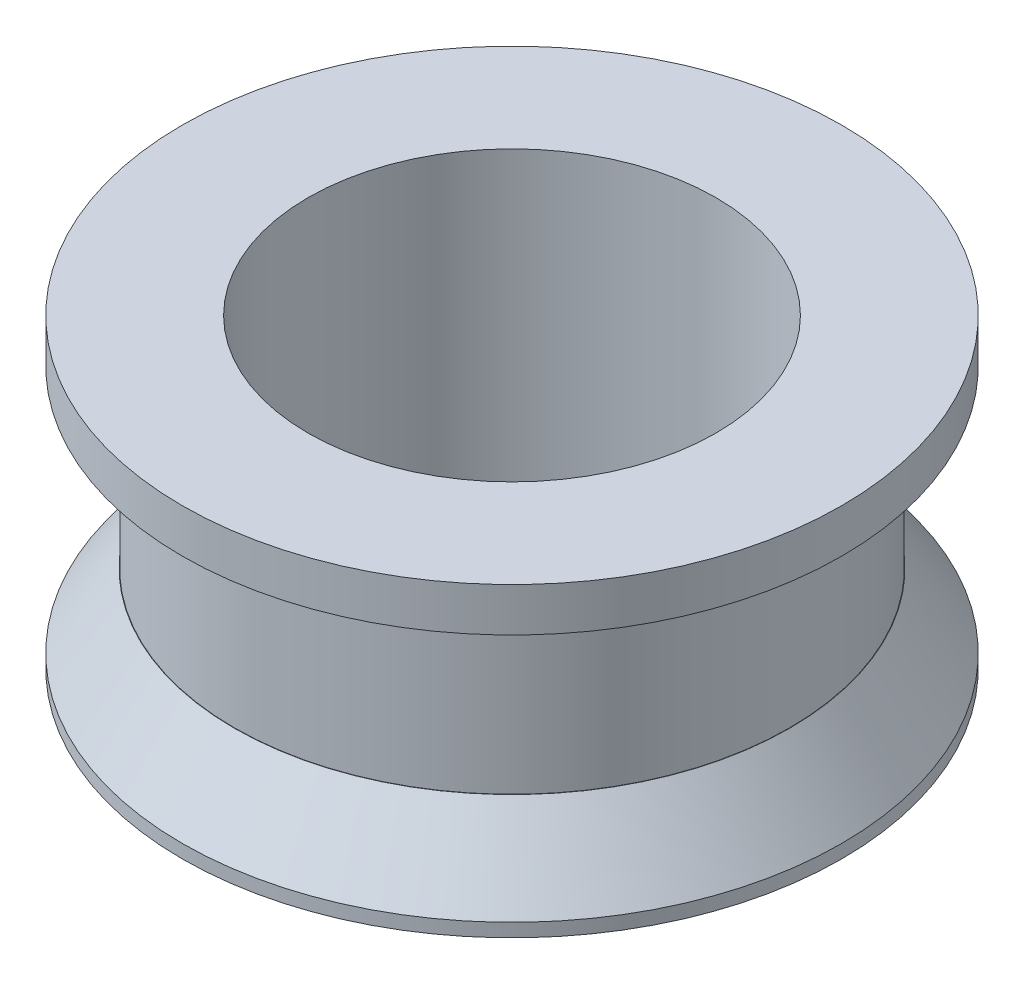
ISO-10303-21;
HEADER;
FILE_DESCRIPTION(('STEP AP214'),'2;1');
FILE_NAME('part.step','',(''),(''),'','','');
FILE_SCHEMA(('AUTOMOTIVE_DESIGN { 1 0 10303 214 1 1 1 1 }'));
ENDSEC;
DATA;
#1=APPLICATION_CONTEXT('core data for automotive mechanical design processes');
#2=APPLICATION_PROTOCOL_DEFINITION('international standard','automotive_design',2000,#1);
#3=PRODUCT_CONTEXT('',#1,'mechanical');
#4=PRODUCT('Part','Part','',(#3));
#5=PRODUCT_RELATED_PRODUCT_CATEGORY('part','',(#4));
#6=PRODUCT_DEFINITION_FORMATION('','',#4);
#7=PRODUCT_DEFINITION_CONTEXT('part definition',#1,'design');
#8=PRODUCT_DEFINITION('design','',#6,#7);
#9=PRODUCT_DEFINITION_SHAPE('','',#8);
#10=(LENGTH_UNIT() NAMED_UNIT(*) SI_UNIT(.MILLI.,.METRE.));
#11=(NAMED_UNIT(*) PLANE_ANGLE_UNIT() SI_UNIT($,.RADIAN.));
#12=(NAMED_UNIT(*) SI_UNIT($,.STERADIAN.) SOLID_ANGLE_UNIT());
#13=UNCERTAINTY_MEASURE_WITH_UNIT(LENGTH_MEASURE(1.E-05),#10,'distance_accuracy_value','');
#14=(GEOMETRIC_REPRESENTATION_CONTEXT(3) GLOBAL_UNCERTAINTY_ASSIGNED_CONTEXT((#13)) GLOBAL_UNIT_ASSIGNED_CONTEXT((#10,
#11,#12)) REPRESENTATION_CONTEXT('',''));
#15=CARTESIAN_POINT('',(0.,0.,0.));
#16=DIRECTION('',(0.,0.,1.));
#17=DIRECTION('',(1.,0.,0.));
#18=AXIS2_PLACEMENT_3D('',#15,#16,#17);
#19=CARTESIAN_POINT('',(0.,6.,0.));
#20=DIRECTION('',(0.,-1.,0.));
#21=DIRECTION('',(0.,0.,-1.));
#22=AXIS2_PLACEMENT_3D('',#19,#20,#21);
#23=CYLINDRICAL_SURFACE('',#22,9.525);
#24=CARTESIAN_POINT('',(0.,6.,0.));
#25=DIRECTION('',(0.,1.,0.));
#26=DIRECTION('',(0.,0.,1.));
#27=AXIS2_PLACEMENT_3D('',#24,#25,#26);
#28=CIRCLE('',#27,9.525);
#29=CARTESIAN_POINT('',(0.,6.,9.525));
#30=VERTEX_POINT('',#29);
#31=EDGE_CURVE('E42',#30,#30,#28,.T.);
#32=ORIENTED_EDGE('',*,*,#31,.F.);
#33=EDGE_LOOP('',(#32));
#34=FACE_BOUND('',#33,.T.);
#35=CARTESIAN_POINT('',(0.,0.,0.));
#36=DIRECTION('',(0.,-1.,0.));
#37=DIRECTION('',(0.,0.,-1.));
#38=AXIS2_PLACEMENT_3D('',#35,#36,#37);
#39=CIRCLE('',#38,9.525);
#40=CARTESIAN_POINT('',(0.,0.,-9.525));
#41=VERTEX_POINT('',#40);
#42=EDGE_CURVE('E57',#41,#41,#39,.T.);
#43=ORIENTED_EDGE('',*,*,#42,.F.);
#44=EDGE_LOOP('',(#43));
#45=FACE_BOUND('',#44,.T.);
#46=ADVANCED_FACE('F31',(#34,#45),#23,.T.);
#47=CARTESIAN_POINT('',(0.,6.,0.));
#48=DIRECTION('',(0.,-1.,0.));
#49=DIRECTION('',(0.,0.,-1.));
#50=AXIS2_PLACEMENT_3D('',#47,#48,#49);
#51=CYLINDRICAL_SURFACE('',#50,7.);
#52=CARTESIAN_POINT('',(0.,7.5,0.));
#53=DIRECTION('',(0.,1.,0.));
#54=DIRECTION('',(0.,0.,1.));
#55=AXIS2_PLACEMENT_3D('',#52,#53,#54);
#56=CIRCLE('',#55,7.);
#57=CARTESIAN_POINT('',(0.,7.5,7.));
#58=VERTEX_POINT('',#57);
#59=EDGE_CURVE('E52',#58,#58,#56,.T.);
#60=ORIENTED_EDGE('',*,*,#59,.T.);
#61=EDGE_LOOP('',(#60));
#62=FACE_BOUND('',#61,.T.);
#63=CARTESIAN_POINT('',(0.,-3.,0.));
#64=DIRECTION('',(0.,-1.,0.));
#65=DIRECTION('',(0.,0.,-1.));
#66=AXIS2_PLACEMENT_3D('',#63,#64,#65);
#67=CIRCLE('',#66,7.);
#68=CARTESIAN_POINT('',(0.,-3.,-7.));
#69=VERTEX_POINT('',#68);
#70=EDGE_CURVE('E63',#69,#69,#67,.T.);
#71=ORIENTED_EDGE('',*,*,#70,.T.);
#72=EDGE_LOOP('',(#71));
#73=FACE_BOUND('',#72,.T.);
#74=ADVANCED_FACE('F67',(#62,#73),#51,.F.);
#75=CARTESIAN_POINT('',(0.,6.,0.));
#76=DIRECTION('',(0.,1.,0.));
#77=DIRECTION('',(0.,0.,1.));
#78=AXIS2_PLACEMENT_3D('',#75,#76,#77);
#79=PLANE('',#78);
#80=CARTESIAN_POINT('',(0.,6.,0.));
#81=DIRECTION('',(0.,1.,0.));
#82=DIRECTION('',(0.,0.,1.));
#83=AXIS2_PLACEMENT_3D('',#80,#81,#82);
#84=CIRCLE('',#83,11.3157536397573);
#85=CARTESIAN_POINT('',(0.,6.,11.3157536397573));
#86=VERTEX_POINT('',#85);
#87=EDGE_CURVE('E49',#86,#86,#84,.T.);
#88=ORIENTED_EDGE('',*,*,#87,.F.);
#89=EDGE_LOOP('',(#88));
#90=FACE_BOUND('',#89,.T.);
#91=ORIENTED_EDGE('',*,*,#31,.T.);
#92=EDGE_LOOP('',(#91));
#93=FACE_BOUND('',#92,.T.);
#94=ADVANCED_FACE('F87',(#90,#93),#79,.F.);
#95=CARTESIAN_POINT('',(0.,7.5,0.));
#96=DIRECTION('',(0.,1.,0.));
#97=DIRECTION('',(0.,0.,1.));
#98=AXIS2_PLACEMENT_3D('',#95,#96,#97);
#99=PLANE('',#98);
#100=CARTESIAN_POINT('',(0.,7.5,0.));
#101=DIRECTION('',(0.,1.,0.));
#102=DIRECTION('',(0.,0.,1.));
#103=AXIS2_PLACEMENT_3D('',#100,#101,#102);
#104=CIRCLE('',#103,11.3157536397573);
#105=CARTESIAN_POINT('',(0.,7.5,11.3157536397573));
#106=VERTEX_POINT('',#105);
#107=EDGE_CURVE('E46',#106,#106,#104,.T.);
#108=ORIENTED_EDGE('',*,*,#107,.T.);
#109=EDGE_LOOP('',(#108));
#110=FACE_BOUND('',#109,.T.);
#111=ORIENTED_EDGE('',*,*,#59,.F.);
#112=EDGE_LOOP('',(#111));
#113=FACE_BOUND('',#112,.T.);
#114=ADVANCED_FACE('F95',(#110,#113),#99,.T.);
#115=CARTESIAN_POINT('',(0.,7.5,0.));
#116=DIRECTION('',(0.,-1.,0.));
#117=DIRECTION('',(0.,0.,-1.));
#118=AXIS2_PLACEMENT_3D('',#115,#116,#117);
#119=CYLINDRICAL_SURFACE('',#118,11.3157536397573);
#120=ORIENTED_EDGE('',*,*,#107,.F.);
#121=EDGE_LOOP('',(#120));
#122=FACE_BOUND('',#121,.T.);
#123=ORIENTED_EDGE('',*,*,#87,.T.);
#124=EDGE_LOOP('',(#123));
#125=FACE_BOUND('',#124,.T.);
#126=ADVANCED_FACE('F80',(#122,#125),#119,.T.);
#127=CARTESIAN_POINT('',(0.,0.,0.));
#128=DIRECTION('',(0.,-1.,0.));
#129=DIRECTION('',(0.,0.,-1.));
#130=AXIS2_PLACEMENT_3D('',#127,#128,#129);
#131=PLANE('',#130);
#132=CARTESIAN_POINT('',(0.,0.,0.));
#133=DIRECTION('',(0.,-1.,0.));
#134=DIRECTION('',(0.,0.,-1.));
#135=AXIS2_PLACEMENT_3D('',#132,#133,#134);
#136=CIRCLE('',#135,9.53775363975734);
#137=CARTESIAN_POINT('',(0.,0.,-9.53775363975734));
#138=VERTEX_POINT('',#137);
#139=EDGE_CURVE('E10',#138,#138,#136,.F.);
#140=ORIENTED_EDGE('',*,*,#139,.T.);
#141=EDGE_LOOP('',(#140));
#142=FACE_BOUND('',#141,.T.);
#143=ORIENTED_EDGE('',*,*,#42,.T.);
#144=EDGE_LOOP('',(#143));
#145=FACE_BOUND('',#144,.T.);
#146=ADVANCED_FACE('F72',(#142,#145),#131,.F.);
#147=CARTESIAN_POINT('',(0.,-3.,0.));
#148=DIRECTION('',(0.,-1.,0.));
#149=DIRECTION('',(0.,0.,-1.));
#150=AXIS2_PLACEMENT_3D('',#147,#148,#149);
#151=PLANE('',#150);
#152=CARTESIAN_POINT('',(0.,-3.,0.));
#153=DIRECTION('',(0.,-1.,0.));
#154=DIRECTION('',(0.,0.,-1.));
#155=AXIS2_PLACEMENT_3D('',#152,#153,#154);
#156=CIRCLE('',#155,11.3157536397573);
#157=CARTESIAN_POINT('',(0.,-3.,-11.3157536397573));
#158=VERTEX_POINT('',#157);
#159=EDGE_CURVE('E60',#158,#158,#156,.T.);
#160=ORIENTED_EDGE('',*,*,#159,.T.);
#161=EDGE_LOOP('',(#160));
#162=FACE_BOUND('',#161,.T.);
#163=ORIENTED_EDGE('',*,*,#70,.F.);
#164=EDGE_LOOP('',(#163));
#165=FACE_BOUND('',#164,.T.);
#166=ADVANCED_FACE('F69',(#162,#165),#151,.T.);
#167=CARTESIAN_POINT('',(0.,-3.,0.));
#168=DIRECTION('',(0.,1.,0.));
#169=DIRECTION('',(0.,0.,1.));
#170=AXIS2_PLACEMENT_3D('',#167,#168,#169);
#171=CYLINDRICAL_SURFACE('',#170,11.3157536397573);
#172=CARTESIAN_POINT('',(0.,-2.53924715598748,0.));
#173=DIRECTION('',(0.,-1.,0.));
#174=DIRECTION('',(0.,0.,-1.));
#175=AXIS2_PLACEMENT_3D('',#172,#173,#174);
#176=CIRCLE('',#175,11.3157536397573);
#177=CARTESIAN_POINT('',(0.,-2.53924715598748,-11.3157536397573));
#178=VERTEX_POINT('',#177);
#179=EDGE_CURVE('E38',#178,#178,#176,.T.);
#180=ORIENTED_EDGE('',*,*,#179,.T.);
#181=EDGE_LOOP('',(#180));
#182=FACE_BOUND('',#181,.T.);
#183=ORIENTED_EDGE('',*,*,#159,.F.);
#184=EDGE_LOOP('',(#183));
#185=FACE_BOUND('',#184,.T.);
#186=ADVANCED_FACE('F71',(#182,#185),#171,.T.);
#187=CARTESIAN_POINT('',(0.,-2.53924715598748,0.));
#188=DIRECTION('',(0.,-1.,0.));
#189=DIRECTION('',(0.,0.,-1.));
#190=AXIS2_PLACEMENT_3D('',#187,#188,#189);
#191=CONICAL_SURFACE('',#190,11.3157536397573,0.610865238198017);
#192=ORIENTED_EDGE('',*,*,#139,.F.);
#193=EDGE_LOOP('',(#192));
#194=FACE_BOUND('',#193,.T.);
#195=ORIENTED_EDGE('',*,*,#179,.F.);
#196=EDGE_LOOP('',(#195));
#197=FACE_BOUND('',#196,.T.);
#198=ADVANCED_FACE('F33',(#194,#197),#191,.T.);
#199=CLOSED_SHELL('',(#46,#74,#94,#114,#126,#146,#166,#186,#198));
#200=MANIFOLD_SOLID_BREP('B2',#199);
#201=ADVANCED_BREP_SHAPE_REPRESENTATION('',(#18,#200),#14);
#202=SHAPE_DEFINITION_REPRESENTATION(#9,#201);
ENDSEC;
END-ISO-10303-21;
